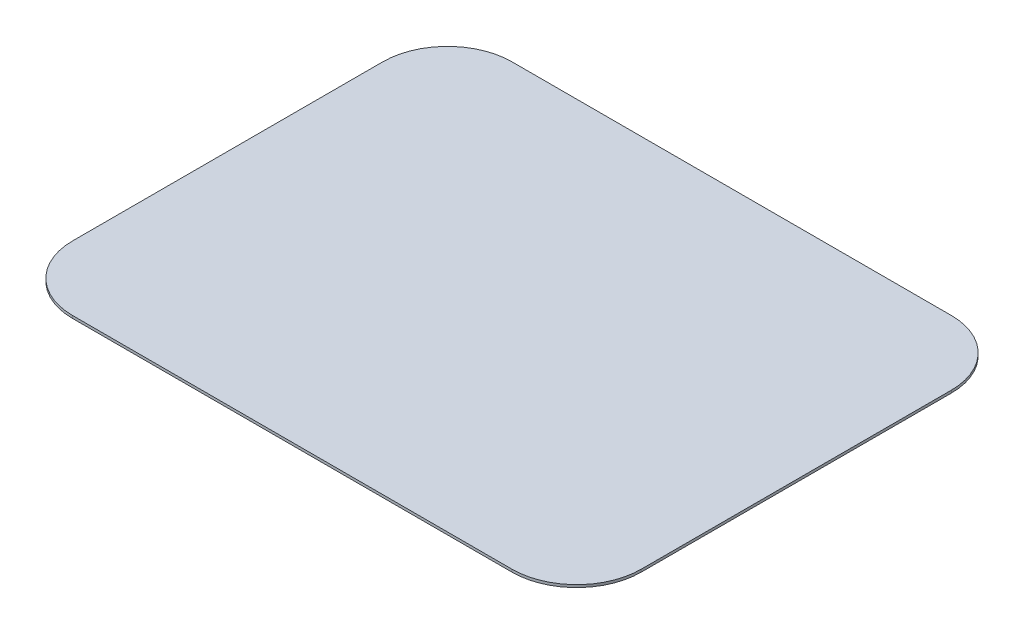
ISO-10303-21;
HEADER;
FILE_DESCRIPTION(('STEP AP214'),'2;1');
FILE_NAME('part.step','',(''),(''),'','','');
FILE_SCHEMA(('AUTOMOTIVE_DESIGN { 1 0 10303 214 1 1 1 1 }'));
ENDSEC;
DATA;
#1=APPLICATION_CONTEXT('core data for automotive mechanical design processes');
#2=APPLICATION_PROTOCOL_DEFINITION('international standard','automotive_design',2000,#1);
#3=PRODUCT_CONTEXT('',#1,'mechanical');
#4=PRODUCT('Part','Part','',(#3));
#5=PRODUCT_RELATED_PRODUCT_CATEGORY('part','',(#4));
#6=PRODUCT_DEFINITION_FORMATION('','',#4);
#7=PRODUCT_DEFINITION_CONTEXT('part definition',#1,'design');
#8=PRODUCT_DEFINITION('design','',#6,#7);
#9=PRODUCT_DEFINITION_SHAPE('','',#8);
#10=(LENGTH_UNIT() NAMED_UNIT(*) SI_UNIT(.MILLI.,.METRE.));
#11=(NAMED_UNIT(*) PLANE_ANGLE_UNIT() SI_UNIT($,.RADIAN.));
#12=(NAMED_UNIT(*) SI_UNIT($,.STERADIAN.) SOLID_ANGLE_UNIT());
#13=UNCERTAINTY_MEASURE_WITH_UNIT(LENGTH_MEASURE(1.E-05),#10,'distance_accuracy_value','');
#14=(GEOMETRIC_REPRESENTATION_CONTEXT(3) GLOBAL_UNCERTAINTY_ASSIGNED_CONTEXT((#13)) GLOBAL_UNIT_ASSIGNED_CONTEXT((#10,
#11,#12)) REPRESENTATION_CONTEXT('',''));
#15=CARTESIAN_POINT('',(0.,0.,0.));
#16=DIRECTION('',(0.,0.,1.));
#17=DIRECTION('',(1.,0.,0.));
#18=AXIS2_PLACEMENT_3D('',#15,#16,#17);
#19=CARTESIAN_POINT('',(-17.,-0.2,12.));
#20=DIRECTION('',(0.,1.,0.));
#21=DIRECTION('',(0.,0.,1.));
#22=AXIS2_PLACEMENT_3D('',#19,#20,#21);
#23=CYLINDRICAL_SURFACE('',#22,5.);
#24=CARTESIAN_POINT('',(-17.,0.,12.));
#25=DIRECTION('',(0.,1.,0.));
#26=DIRECTION('',(0.,0.,1.));
#27=AXIS2_PLACEMENT_3D('',#24,#25,#26);
#28=CIRCLE('',#27,5.);
#29=CARTESIAN_POINT('',(-22.,0.,12.));
#30=VERTEX_POINT('',#29);
#31=CARTESIAN_POINT('',(-17.,0.,17.));
#32=VERTEX_POINT('',#31);
#33=EDGE_CURVE('E125',#30,#32,#28,.T.);
#34=ORIENTED_EDGE('',*,*,#33,.F.);
#35=DIRECTION('',(0.,1.,0.));
#36=VECTOR('',#35,1.);
#37=CARTESIAN_POINT('',(-22.,-0.2,12.));
#38=LINE('',#37,#36);
#39=CARTESIAN_POINT('',(-22.,-0.2,12.));
#40=VERTEX_POINT('',#39);
#41=EDGE_CURVE('E11',#40,#30,#38,.T.);
#42=ORIENTED_EDGE('',*,*,#41,.F.);
#43=CARTESIAN_POINT('',(-17.,-0.2,12.));
#44=DIRECTION('',(0.,1.,0.));
#45=DIRECTION('',(0.,0.,1.));
#46=AXIS2_PLACEMENT_3D('',#43,#44,#45);
#47=CIRCLE('',#46,5.);
#48=CARTESIAN_POINT('',(-17.,-0.2,17.));
#49=VERTEX_POINT('',#48);
#50=EDGE_CURVE('E145',#40,#49,#47,.T.);
#51=ORIENTED_EDGE('',*,*,#50,.T.);
#52=DIRECTION('',(0.,1.,0.));
#53=VECTOR('',#52,1.);
#54=CARTESIAN_POINT('',(-17.,-0.2,17.));
#55=LINE('',#54,#53);
#56=EDGE_CURVE('E31',#49,#32,#55,.T.);
#57=ORIENTED_EDGE('',*,*,#56,.T.);
#58=EDGE_LOOP('',(#34,#42,#51,#57));
#59=FACE_BOUND('',#58,.T.);
#60=ADVANCED_FACE('F28',(#59),#23,.T.);
#61=CARTESIAN_POINT('',(-22.,-0.2,-12.));
#62=DIRECTION('',(-1.,0.,0.));
#63=DIRECTION('',(0.,0.,1.));
#64=AXIS2_PLACEMENT_3D('',#61,#62,#63);
#65=PLANE('',#64);
#66=DIRECTION('',(0.,0.,1.));
#67=VECTOR('',#66,1.);
#68=CARTESIAN_POINT('',(-22.,0.,-12.));
#69=LINE('',#68,#67);
#70=CARTESIAN_POINT('',(-22.,0.,-12.));
#71=VERTEX_POINT('',#70);
#72=EDGE_CURVE('E143',#71,#30,#69,.T.);
#73=ORIENTED_EDGE('',*,*,#72,.F.);
#74=DIRECTION('',(0.,1.,0.));
#75=VECTOR('',#74,1.);
#76=CARTESIAN_POINT('',(-22.,-0.2,-12.));
#77=LINE('',#76,#75);
#78=CARTESIAN_POINT('',(-22.,-0.2,-12.));
#79=VERTEX_POINT('',#78);
#80=EDGE_CURVE('E37',#79,#71,#77,.T.);
#81=ORIENTED_EDGE('',*,*,#80,.F.);
#82=DIRECTION('',(0.,0.,1.));
#83=VECTOR('',#82,1.);
#84=CARTESIAN_POINT('',(-22.,-0.2,-12.));
#85=LINE('',#84,#83);
#86=EDGE_CURVE('E115',#79,#40,#85,.T.);
#87=ORIENTED_EDGE('',*,*,#86,.T.);
#88=ORIENTED_EDGE('',*,*,#41,.T.);
#89=EDGE_LOOP('',(#73,#81,#87,#88));
#90=FACE_BOUND('',#89,.T.);
#91=ADVANCED_FACE('F157',(#90),#65,.T.);
#92=CARTESIAN_POINT('',(-17.,-0.2,-12.));
#93=DIRECTION('',(0.,1.,0.));
#94=DIRECTION('',(0.,0.,1.));
#95=AXIS2_PLACEMENT_3D('',#92,#93,#94);
#96=CYLINDRICAL_SURFACE('',#95,5.);
#97=CARTESIAN_POINT('',(-17.,0.,-12.));
#98=DIRECTION('',(0.,1.,0.));
#99=DIRECTION('',(0.,0.,1.));
#100=AXIS2_PLACEMENT_3D('',#97,#98,#99);
#101=CIRCLE('',#100,5.);
#102=CARTESIAN_POINT('',(-17.,0.,-17.));
#103=VERTEX_POINT('',#102);
#104=EDGE_CURVE('E102',#103,#71,#101,.T.);
#105=ORIENTED_EDGE('',*,*,#104,.F.);
#106=DIRECTION('',(0.,1.,0.));
#107=VECTOR('',#106,1.);
#108=CARTESIAN_POINT('',(-17.,-0.2,-17.));
#109=LINE('',#108,#107);
#110=CARTESIAN_POINT('',(-17.,-0.2,-17.));
#111=VERTEX_POINT('',#110);
#112=EDGE_CURVE('E97',#111,#103,#109,.T.);
#113=ORIENTED_EDGE('',*,*,#112,.F.);
#114=CARTESIAN_POINT('',(-17.,-0.2,-12.));
#115=DIRECTION('',(0.,1.,0.));
#116=DIRECTION('',(0.,0.,1.));
#117=AXIS2_PLACEMENT_3D('',#114,#115,#116);
#118=CIRCLE('',#117,5.);
#119=EDGE_CURVE('E100',#111,#79,#118,.T.);
#120=ORIENTED_EDGE('',*,*,#119,.T.);
#121=ORIENTED_EDGE('',*,*,#80,.T.);
#122=EDGE_LOOP('',(#105,#113,#120,#121));
#123=FACE_BOUND('',#122,.T.);
#124=ADVANCED_FACE('F99',(#123),#96,.T.);
#125=CARTESIAN_POINT('',(-17.,-0.2,-17.));
#126=DIRECTION('',(0.,0.,-1.));
#127=DIRECTION('',(-1.,0.,0.));
#128=AXIS2_PLACEMENT_3D('',#125,#126,#127);
#129=PLANE('',#128);
#130=DIRECTION('',(-1.,0.,0.));
#131=VECTOR('',#130,1.);
#132=CARTESIAN_POINT('',(-17.,0.,-17.));
#133=LINE('',#132,#131);
#134=CARTESIAN_POINT('',(17.,0.,-17.));
#135=VERTEX_POINT('',#134);
#136=EDGE_CURVE('E140',#135,#103,#133,.T.);
#137=ORIENTED_EDGE('',*,*,#136,.F.);
#138=DIRECTION('',(0.,1.,0.));
#139=VECTOR('',#138,1.);
#140=CARTESIAN_POINT('',(17.,-0.2,-17.));
#141=LINE('',#140,#139);
#142=CARTESIAN_POINT('',(17.,-0.2,-17.));
#143=VERTEX_POINT('',#142);
#144=EDGE_CURVE('E107',#143,#135,#141,.T.);
#145=ORIENTED_EDGE('',*,*,#144,.F.);
#146=DIRECTION('',(-1.,0.,0.));
#147=VECTOR('',#146,1.);
#148=CARTESIAN_POINT('',(-17.,-0.2,-17.));
#149=LINE('',#148,#147);
#150=EDGE_CURVE('E113',#143,#111,#149,.T.);
#151=ORIENTED_EDGE('',*,*,#150,.T.);
#152=ORIENTED_EDGE('',*,*,#112,.T.);
#153=EDGE_LOOP('',(#137,#145,#151,#152));
#154=FACE_BOUND('',#153,.T.);
#155=ADVANCED_FACE('F117',(#154),#129,.T.);
#156=CARTESIAN_POINT('',(17.,-0.2,-12.));
#157=DIRECTION('',(0.,1.,0.));
#158=DIRECTION('',(0.,0.,1.));
#159=AXIS2_PLACEMENT_3D('',#156,#157,#158);
#160=CYLINDRICAL_SURFACE('',#159,5.);
#161=CARTESIAN_POINT('',(17.,0.,-12.));
#162=DIRECTION('',(0.,1.,0.));
#163=DIRECTION('',(0.,0.,1.));
#164=AXIS2_PLACEMENT_3D('',#161,#162,#163);
#165=CIRCLE('',#164,5.);
#166=CARTESIAN_POINT('',(22.,0.,-12.));
#167=VERTEX_POINT('',#166);
#168=EDGE_CURVE('E137',#167,#135,#165,.T.);
#169=ORIENTED_EDGE('',*,*,#168,.F.);
#170=DIRECTION('',(0.,1.,0.));
#171=VECTOR('',#170,1.);
#172=CARTESIAN_POINT('',(22.,-0.2,-12.));
#173=LINE('',#172,#171);
#174=CARTESIAN_POINT('',(22.,-0.2,-12.));
#175=VERTEX_POINT('',#174);
#176=EDGE_CURVE('E149',#175,#167,#173,.T.);
#177=ORIENTED_EDGE('',*,*,#176,.F.);
#178=CARTESIAN_POINT('',(17.,-0.2,-12.));
#179=DIRECTION('',(0.,1.,0.));
#180=DIRECTION('',(0.,0.,1.));
#181=AXIS2_PLACEMENT_3D('',#178,#179,#180);
#182=CIRCLE('',#181,5.);
#183=EDGE_CURVE('E118',#175,#143,#182,.T.);
#184=ORIENTED_EDGE('',*,*,#183,.T.);
#185=ORIENTED_EDGE('',*,*,#144,.T.);
#186=EDGE_LOOP('',(#169,#177,#184,#185));
#187=FACE_BOUND('',#186,.T.);
#188=ADVANCED_FACE('F170',(#187),#160,.T.);
#189=CARTESIAN_POINT('',(22.,-0.2,-12.));
#190=DIRECTION('',(1.,0.,0.));
#191=DIRECTION('',(0.,0.,-1.));
#192=AXIS2_PLACEMENT_3D('',#189,#190,#191);
#193=PLANE('',#192);
#194=DIRECTION('',(0.,0.,-1.));
#195=VECTOR('',#194,1.);
#196=CARTESIAN_POINT('',(22.,0.,-12.));
#197=LINE('',#196,#195);
#198=CARTESIAN_POINT('',(22.,0.,12.));
#199=VERTEX_POINT('',#198);
#200=EDGE_CURVE('E134',#199,#167,#197,.T.);
#201=ORIENTED_EDGE('',*,*,#200,.F.);
#202=DIRECTION('',(0.,1.,0.));
#203=VECTOR('',#202,1.);
#204=CARTESIAN_POINT('',(22.,-0.2,12.));
#205=LINE('',#204,#203);
#206=CARTESIAN_POINT('',(22.,-0.2,12.));
#207=VERTEX_POINT('',#206);
#208=EDGE_CURVE('E151',#207,#199,#205,.T.);
#209=ORIENTED_EDGE('',*,*,#208,.F.);
#210=DIRECTION('',(0.,0.,-1.));
#211=VECTOR('',#210,1.);
#212=CARTESIAN_POINT('',(22.,-0.2,-12.));
#213=LINE('',#212,#211);
#214=EDGE_CURVE('E120',#207,#175,#213,.T.);
#215=ORIENTED_EDGE('',*,*,#214,.T.);
#216=ORIENTED_EDGE('',*,*,#176,.T.);
#217=EDGE_LOOP('',(#201,#209,#215,#216));
#218=FACE_BOUND('',#217,.T.);
#219=ADVANCED_FACE('F173',(#218),#193,.T.);
#220=CARTESIAN_POINT('',(17.,-0.2,12.));
#221=DIRECTION('',(0.,1.,0.));
#222=DIRECTION('',(0.,0.,1.));
#223=AXIS2_PLACEMENT_3D('',#220,#221,#222);
#224=CYLINDRICAL_SURFACE('',#223,5.);
#225=CARTESIAN_POINT('',(17.,0.,12.));
#226=DIRECTION('',(0.,1.,0.));
#227=DIRECTION('',(0.,0.,1.));
#228=AXIS2_PLACEMENT_3D('',#225,#226,#227);
#229=CIRCLE('',#228,5.);
#230=CARTESIAN_POINT('',(17.,0.,17.));
#231=VERTEX_POINT('',#230);
#232=EDGE_CURVE('E131',#231,#199,#229,.T.);
#233=ORIENTED_EDGE('',*,*,#232,.F.);
#234=DIRECTION('',(0.,1.,0.));
#235=VECTOR('',#234,1.);
#236=CARTESIAN_POINT('',(17.,-0.2,17.));
#237=LINE('',#236,#235);
#238=CARTESIAN_POINT('',(17.,-0.2,17.));
#239=VERTEX_POINT('',#238);
#240=EDGE_CURVE('E152',#239,#231,#237,.T.);
#241=ORIENTED_EDGE('',*,*,#240,.F.);
#242=CARTESIAN_POINT('',(17.,-0.2,12.));
#243=DIRECTION('',(0.,1.,0.));
#244=DIRECTION('',(0.,0.,1.));
#245=AXIS2_PLACEMENT_3D('',#242,#243,#244);
#246=CIRCLE('',#245,5.);
#247=EDGE_CURVE('E228',#239,#207,#246,.T.);
#248=ORIENTED_EDGE('',*,*,#247,.T.);
#249=ORIENTED_EDGE('',*,*,#208,.T.);
#250=EDGE_LOOP('',(#233,#241,#248,#249));
#251=FACE_BOUND('',#250,.T.);
#252=ADVANCED_FACE('F177',(#251),#224,.T.);
#253=CARTESIAN_POINT('',(-17.,-0.2,17.));
#254=DIRECTION('',(0.,0.,1.));
#255=DIRECTION('',(1.,0.,0.));
#256=AXIS2_PLACEMENT_3D('',#253,#254,#255);
#257=PLANE('',#256);
#258=DIRECTION('',(1.,0.,0.));
#259=VECTOR('',#258,1.);
#260=CARTESIAN_POINT('',(-17.,0.,17.));
#261=LINE('',#260,#259);
#262=EDGE_CURVE('E128',#32,#231,#261,.T.);
#263=ORIENTED_EDGE('',*,*,#262,.F.);
#264=ORIENTED_EDGE('',*,*,#56,.F.);
#265=DIRECTION('',(1.,0.,0.));
#266=VECTOR('',#265,1.);
#267=CARTESIAN_POINT('',(-17.,-0.2,17.));
#268=LINE('',#267,#266);
#269=EDGE_CURVE('E229',#49,#239,#268,.T.);
#270=ORIENTED_EDGE('',*,*,#269,.T.);
#271=ORIENTED_EDGE('',*,*,#240,.T.);
#272=EDGE_LOOP('',(#263,#264,#270,#271));
#273=FACE_BOUND('',#272,.T.);
#274=ADVANCED_FACE('F154',(#273),#257,.T.);
#275=CARTESIAN_POINT('',(-17.,-0.2,12.));
#276=DIRECTION('',(0.,1.,0.));
#277=DIRECTION('',(0.,0.,1.));
#278=AXIS2_PLACEMENT_3D('',#275,#276,#277);
#279=PLANE('',#278);
#280=ORIENTED_EDGE('',*,*,#50,.F.);
#281=ORIENTED_EDGE('',*,*,#86,.F.);
#282=ORIENTED_EDGE('',*,*,#119,.F.);
#283=ORIENTED_EDGE('',*,*,#150,.F.);
#284=ORIENTED_EDGE('',*,*,#183,.F.);
#285=ORIENTED_EDGE('',*,*,#214,.F.);
#286=ORIENTED_EDGE('',*,*,#247,.F.);
#287=ORIENTED_EDGE('',*,*,#269,.F.);
#288=EDGE_LOOP('',(#280,#281,#282,#283,#284,#285,#286,#287));
#289=FACE_BOUND('',#288,.T.);
#290=ADVANCED_FACE('F111',(#289),#279,.F.);
#291=CARTESIAN_POINT('',(-17.,0.,12.));
#292=DIRECTION('',(0.,1.,0.));
#293=DIRECTION('',(0.,0.,1.));
#294=AXIS2_PLACEMENT_3D('',#291,#292,#293);
#295=PLANE('',#294);
#296=ORIENTED_EDGE('',*,*,#33,.T.);
#297=ORIENTED_EDGE('',*,*,#262,.T.);
#298=ORIENTED_EDGE('',*,*,#232,.T.);
#299=ORIENTED_EDGE('',*,*,#200,.T.);
#300=ORIENTED_EDGE('',*,*,#168,.T.);
#301=ORIENTED_EDGE('',*,*,#136,.T.);
#302=ORIENTED_EDGE('',*,*,#104,.T.);
#303=ORIENTED_EDGE('',*,*,#72,.T.);
#304=EDGE_LOOP('',(#296,#297,#298,#299,#300,#301,#302,#303));
#305=FACE_BOUND('',#304,.T.);
#306=ADVANCED_FACE('F156',(#305),#295,.T.);
#307=CLOSED_SHELL('',(#60,#91,#124,#155,#188,#219,#252,#274,#290,#306));
#308=MANIFOLD_SOLID_BREP('B2',#307);
#309=ADVANCED_BREP_SHAPE_REPRESENTATION('',(#18,#308),#14);
#310=SHAPE_DEFINITION_REPRESENTATION(#9,#309);
ENDSEC;
END-ISO-10303-21;
